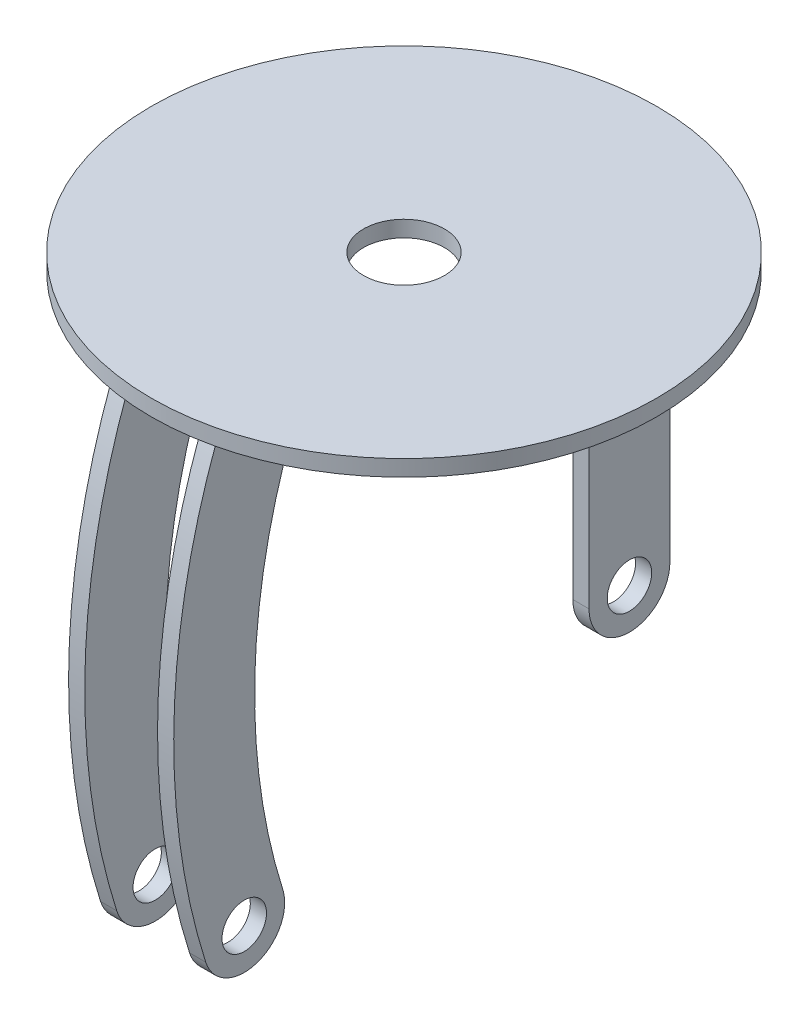
ISO-10303-21;
HEADER;
FILE_DESCRIPTION(('STEP AP214'),'2;1');
FILE_NAME('part.step','',(''),(''),'','','');
FILE_SCHEMA(('AUTOMOTIVE_DESIGN { 1 0 10303 214 1 1 1 1 }'));
ENDSEC;
DATA;
#1=APPLICATION_CONTEXT('core data for automotive mechanical design processes');
#2=APPLICATION_PROTOCOL_DEFINITION('international standard','automotive_design',2000,#1);
#3=PRODUCT_CONTEXT('',#1,'mechanical');
#4=PRODUCT('Part','Part','',(#3));
#5=PRODUCT_RELATED_PRODUCT_CATEGORY('part','',(#4));
#6=PRODUCT_DEFINITION_FORMATION('','',#4);
#7=PRODUCT_DEFINITION_CONTEXT('part definition',#1,'design');
#8=PRODUCT_DEFINITION('design','',#6,#7);
#9=PRODUCT_DEFINITION_SHAPE('','',#8);
#10=(LENGTH_UNIT() NAMED_UNIT(*) SI_UNIT(.MILLI.,.METRE.));
#11=(NAMED_UNIT(*) PLANE_ANGLE_UNIT() SI_UNIT($,.RADIAN.));
#12=(NAMED_UNIT(*) SI_UNIT($,.STERADIAN.) SOLID_ANGLE_UNIT());
#13=UNCERTAINTY_MEASURE_WITH_UNIT(LENGTH_MEASURE(1.E-05),#10,'distance_accuracy_value','');
#14=(GEOMETRIC_REPRESENTATION_CONTEXT(3) GLOBAL_UNCERTAINTY_ASSIGNED_CONTEXT((#13)) GLOBAL_UNIT_ASSIGNED_CONTEXT((#10,
#11,#12)) REPRESENTATION_CONTEXT('',''));
#15=CARTESIAN_POINT('',(0.,0.,0.));
#16=DIRECTION('',(0.,0.,1.));
#17=DIRECTION('',(1.,0.,0.));
#18=AXIS2_PLACEMENT_3D('',#15,#16,#17);
#19=CARTESIAN_POINT('',(111.5,-103.,20.));
#20=DIRECTION('',(-1.,0.,0.));
#21=DIRECTION('',(0.,0.,1.));
#22=AXIS2_PLACEMENT_3D('',#19,#20,#21);
#23=PLANE('',#22);
#24=CARTESIAN_POINT('',(111.5,-83.,0.));
#25=DIRECTION('',(1.,0.,0.));
#26=DIRECTION('',(0.,0.,-1.));
#27=AXIS2_PLACEMENT_3D('',#24,#25,#26);
#28=CIRCLE('',#27,11.);
#29=CARTESIAN_POINT('',(111.5,-83.,-11.));
#30=VERTEX_POINT('',#29);
#31=EDGE_CURVE('E245',#30,#30,#28,.T.);
#32=ORIENTED_EDGE('',*,*,#31,.F.);
#33=EDGE_LOOP('',(#32));
#34=FACE_BOUND('',#33,.T.);
#35=DIRECTION('',(0.,1.,0.));
#36=VECTOR('',#35,1.);
#37=CARTESIAN_POINT('',(111.5,-103.,20.));
#38=LINE('',#37,#36);
#39=CARTESIAN_POINT('',(111.5,-83.,20.));
#40=VERTEX_POINT('',#39);
#41=CARTESIAN_POINT('',(111.5,-4.,20.));
#42=VERTEX_POINT('',#41);
#43=EDGE_CURVE('E299',#40,#42,#38,.T.);
#44=ORIENTED_EDGE('',*,*,#43,.F.);
#45=CARTESIAN_POINT('',(111.5,-83.,0.));
#46=DIRECTION('',(1.,0.,0.));
#47=DIRECTION('',(0.,0.,-1.));
#48=AXIS2_PLACEMENT_3D('',#45,#46,#47);
#49=CIRCLE('',#48,20.);
#50=CARTESIAN_POINT('',(111.5,-83.,-20.));
#51=VERTEX_POINT('',#50);
#52=EDGE_CURVE('E239',#40,#51,#49,.T.);
#53=ORIENTED_EDGE('',*,*,#52,.T.);
#54=DIRECTION('',(0.,1.,0.));
#55=VECTOR('',#54,1.);
#56=CARTESIAN_POINT('',(111.5,-103.,-20.));
#57=LINE('',#56,#55);
#58=CARTESIAN_POINT('',(111.5,-4.,-20.));
#59=VERTEX_POINT('',#58);
#60=EDGE_CURVE('E293',#51,#59,#57,.T.);
#61=ORIENTED_EDGE('',*,*,#60,.T.);
#62=DIRECTION('',(0.,0.,1.));
#63=VECTOR('',#62,1.);
#64=CARTESIAN_POINT('',(111.5,-4.,20.));
#65=LINE('',#64,#63);
#66=EDGE_CURVE('E281',#59,#42,#65,.T.);
#67=ORIENTED_EDGE('',*,*,#66,.T.);
#68=EDGE_LOOP('',(#44,#53,#61,#67));
#69=FACE_BOUND('',#68,.T.);
#70=ADVANCED_FACE('F62',(#34,#69),#23,.F.);
#71=CARTESIAN_POINT('',(103.5,-103.,20.));
#72=DIRECTION('',(1.,0.,0.));
#73=DIRECTION('',(0.,0.,-1.));
#74=AXIS2_PLACEMENT_3D('',#71,#72,#73);
#75=PLANE('',#74);
#76=CARTESIAN_POINT('',(103.5,-83.,0.));
#77=DIRECTION('',(1.,0.,0.));
#78=DIRECTION('',(0.,0.,-1.));
#79=AXIS2_PLACEMENT_3D('',#76,#77,#78);
#80=CIRCLE('',#79,11.);
#81=CARTESIAN_POINT('',(103.5,-83.,-11.));
#82=VERTEX_POINT('',#81);
#83=EDGE_CURVE('E258',#82,#82,#80,.T.);
#84=ORIENTED_EDGE('',*,*,#83,.T.);
#85=EDGE_LOOP('',(#84));
#86=FACE_BOUND('',#85,.T.);
#87=CARTESIAN_POINT('',(103.5,-83.,0.));
#88=DIRECTION('',(1.,0.,0.));
#89=DIRECTION('',(0.,0.,-1.));
#90=AXIS2_PLACEMENT_3D('',#87,#88,#89);
#91=CIRCLE('',#90,20.);
#92=CARTESIAN_POINT('',(103.5,-83.,20.));
#93=VERTEX_POINT('',#92);
#94=CARTESIAN_POINT('',(103.5,-83.,-20.));
#95=VERTEX_POINT('',#94);
#96=EDGE_CURVE('E252',#93,#95,#91,.T.);
#97=ORIENTED_EDGE('',*,*,#96,.F.);
#98=DIRECTION('',(0.,1.,0.));
#99=VECTOR('',#98,1.);
#100=CARTESIAN_POINT('',(103.5,-103.,20.));
#101=LINE('',#100,#99);
#102=CARTESIAN_POINT('',(103.5,-4.,20.));
#103=VERTEX_POINT('',#102);
#104=EDGE_CURVE('E297',#93,#103,#101,.T.);
#105=ORIENTED_EDGE('',*,*,#104,.T.);
#106=DIRECTION('',(0.,0.,-1.));
#107=VECTOR('',#106,1.);
#108=CARTESIAN_POINT('',(103.5,-4.,20.));
#109=LINE('',#108,#107);
#110=CARTESIAN_POINT('',(103.5,-4.,-20.));
#111=VERTEX_POINT('',#110);
#112=EDGE_CURVE('E287',#103,#111,#109,.T.);
#113=ORIENTED_EDGE('',*,*,#112,.T.);
#114=DIRECTION('',(0.,1.,0.));
#115=VECTOR('',#114,1.);
#116=CARTESIAN_POINT('',(103.5,-103.,-20.));
#117=LINE('',#116,#115);
#118=EDGE_CURVE('E295',#95,#111,#117,.T.);
#119=ORIENTED_EDGE('',*,*,#118,.F.);
#120=EDGE_LOOP('',(#97,#105,#113,#119));
#121=FACE_BOUND('',#120,.T.);
#122=ADVANCED_FACE('F329',(#86,#121),#75,.F.);
#123=CARTESIAN_POINT('',(-103.5,-103.,20.));
#124=DIRECTION('',(-1.,0.,0.));
#125=DIRECTION('',(0.,0.,1.));
#126=AXIS2_PLACEMENT_3D('',#123,#124,#125);
#127=PLANE('',#126);
#128=CARTESIAN_POINT('',(-103.5,-83.,0.));
#129=DIRECTION('',(-1.,0.,0.));
#130=DIRECTION('',(0.,0.,1.));
#131=AXIS2_PLACEMENT_3D('',#128,#129,#130);
#132=CIRCLE('',#131,11.);
#133=CARTESIAN_POINT('',(-103.5,-83.,-11.));
#134=VERTEX_POINT('',#133);
#135=EDGE_CURVE('E255',#134,#134,#132,.T.);
#136=ORIENTED_EDGE('',*,*,#135,.T.);
#137=EDGE_LOOP('',(#136));
#138=FACE_BOUND('',#137,.T.);
#139=DIRECTION('',(0.,1.,0.));
#140=VECTOR('',#139,1.);
#141=CARTESIAN_POINT('',(-103.5,-103.,20.));
#142=LINE('',#141,#140);
#143=CARTESIAN_POINT('',(-103.5,-83.,20.));
#144=VERTEX_POINT('',#143);
#145=CARTESIAN_POINT('',(-103.5,-4.,20.));
#146=VERTEX_POINT('',#145);
#147=EDGE_CURVE('E279',#144,#146,#142,.T.);
#148=ORIENTED_EDGE('',*,*,#147,.F.);
#149=CARTESIAN_POINT('',(-103.5,-83.,0.));
#150=DIRECTION('',(-1.,0.,0.));
#151=DIRECTION('',(0.,0.,1.));
#152=AXIS2_PLACEMENT_3D('',#149,#150,#151);
#153=CIRCLE('',#152,20.);
#154=CARTESIAN_POINT('',(-103.5,-83.,-20.));
#155=VERTEX_POINT('',#154);
#156=EDGE_CURVE('E250',#155,#144,#153,.T.);
#157=ORIENTED_EDGE('',*,*,#156,.F.);
#158=DIRECTION('',(0.,1.,0.));
#159=VECTOR('',#158,1.);
#160=CARTESIAN_POINT('',(-103.5,-103.,-20.));
#161=LINE('',#160,#159);
#162=CARTESIAN_POINT('',(-103.5,-4.,-20.));
#163=VERTEX_POINT('',#162);
#164=EDGE_CURVE('E273',#155,#163,#161,.T.);
#165=ORIENTED_EDGE('',*,*,#164,.T.);
#166=DIRECTION('',(0.,0.,1.));
#167=VECTOR('',#166,1.);
#168=CARTESIAN_POINT('',(-103.5,-4.,20.));
#169=LINE('',#168,#167);
#170=EDGE_CURVE('E261',#163,#146,#169,.T.);
#171=ORIENTED_EDGE('',*,*,#170,.T.);
#172=EDGE_LOOP('',(#148,#157,#165,#171));
#173=FACE_BOUND('',#172,.T.);
#174=ADVANCED_FACE('F326',(#138,#173),#127,.F.);
#175=CARTESIAN_POINT('',(-111.5,-103.,20.));
#176=DIRECTION('',(1.,0.,0.));
#177=DIRECTION('',(0.,0.,-1.));
#178=AXIS2_PLACEMENT_3D('',#175,#176,#177);
#179=PLANE('',#178);
#180=CARTESIAN_POINT('',(-111.5,-83.,0.));
#181=DIRECTION('',(1.,0.,0.));
#182=DIRECTION('',(0.,0.,-1.));
#183=AXIS2_PLACEMENT_3D('',#180,#181,#182);
#184=CIRCLE('',#183,11.);
#185=CARTESIAN_POINT('',(-111.5,-83.,-11.));
#186=VERTEX_POINT('',#185);
#187=EDGE_CURVE('E254',#186,#186,#184,.T.);
#188=ORIENTED_EDGE('',*,*,#187,.T.);
#189=EDGE_LOOP('',(#188));
#190=FACE_BOUND('',#189,.T.);
#191=CARTESIAN_POINT('',(-111.5,-83.,0.));
#192=DIRECTION('',(1.,0.,0.));
#193=DIRECTION('',(0.,0.,-1.));
#194=AXIS2_PLACEMENT_3D('',#191,#192,#193);
#195=CIRCLE('',#194,20.);
#196=CARTESIAN_POINT('',(-111.5,-83.,20.));
#197=VERTEX_POINT('',#196);
#198=CARTESIAN_POINT('',(-111.5,-83.,-20.));
#199=VERTEX_POINT('',#198);
#200=EDGE_CURVE('E248',#197,#199,#195,.T.);
#201=ORIENTED_EDGE('',*,*,#200,.F.);
#202=DIRECTION('',(0.,1.,0.));
#203=VECTOR('',#202,1.);
#204=CARTESIAN_POINT('',(-111.5,-103.,20.));
#205=LINE('',#204,#203);
#206=CARTESIAN_POINT('',(-111.5,-4.,20.));
#207=VERTEX_POINT('',#206);
#208=EDGE_CURVE('E277',#197,#207,#205,.T.);
#209=ORIENTED_EDGE('',*,*,#208,.T.);
#210=DIRECTION('',(0.,0.,-1.));
#211=VECTOR('',#210,1.);
#212=CARTESIAN_POINT('',(-111.5,-4.,20.));
#213=LINE('',#212,#211);
#214=CARTESIAN_POINT('',(-111.5,-4.,-20.));
#215=VERTEX_POINT('',#214);
#216=EDGE_CURVE('E267',#207,#215,#213,.T.);
#217=ORIENTED_EDGE('',*,*,#216,.T.);
#218=DIRECTION('',(0.,1.,0.));
#219=VECTOR('',#218,1.);
#220=CARTESIAN_POINT('',(-111.5,-103.,-20.));
#221=LINE('',#220,#219);
#222=EDGE_CURVE('E275',#199,#215,#221,.T.);
#223=ORIENTED_EDGE('',*,*,#222,.F.);
#224=EDGE_LOOP('',(#201,#209,#217,#223));
#225=FACE_BOUND('',#224,.T.);
#226=ADVANCED_FACE('F314',(#190,#225),#179,.F.);
#227=CARTESIAN_POINT('',(103.5,-103.,-20.));
#228=DIRECTION('',(0.,0.,1.));
#229=DIRECTION('',(1.,0.,0.));
#230=AXIS2_PLACEMENT_3D('',#227,#228,#229);
#231=PLANE('',#230);
#232=DIRECTION('',(1.,0.,0.));
#233=VECTOR('',#232,1.);
#234=CARTESIAN_POINT('',(-125.,-83.,-20.));
#235=LINE('',#234,#233);
#236=EDGE_CURVE('E242',#95,#51,#235,.T.);
#237=ORIENTED_EDGE('',*,*,#236,.F.);
#238=ORIENTED_EDGE('',*,*,#118,.T.);
#239=DIRECTION('',(1.,0.,0.));
#240=VECTOR('',#239,1.);
#241=CARTESIAN_POINT('',(103.5,-4.,-20.));
#242=LINE('',#241,#240);
#243=EDGE_CURVE('E290',#111,#59,#242,.T.);
#244=ORIENTED_EDGE('',*,*,#243,.T.);
#245=ORIENTED_EDGE('',*,*,#60,.F.);
#246=EDGE_LOOP('',(#237,#238,#244,#245));
#247=FACE_BOUND('',#246,.T.);
#248=ADVANCED_FACE('F350',(#247),#231,.F.);
#249=CARTESIAN_POINT('',(-111.5,-103.,-20.));
#250=DIRECTION('',(0.,0.,1.));
#251=DIRECTION('',(1.,0.,0.));
#252=AXIS2_PLACEMENT_3D('',#249,#250,#251);
#253=PLANE('',#252);
#254=EDGE_CURVE('E244',#199,#155,#235,.T.);
#255=ORIENTED_EDGE('',*,*,#254,.F.);
#256=ORIENTED_EDGE('',*,*,#222,.T.);
#257=DIRECTION('',(1.,0.,0.));
#258=VECTOR('',#257,1.);
#259=CARTESIAN_POINT('',(-111.5,-4.,-20.));
#260=LINE('',#259,#258);
#261=EDGE_CURVE('E270',#215,#163,#260,.T.);
#262=ORIENTED_EDGE('',*,*,#261,.T.);
#263=ORIENTED_EDGE('',*,*,#164,.F.);
#264=EDGE_LOOP('',(#255,#256,#262,#263));
#265=FACE_BOUND('',#264,.T.);
#266=ADVANCED_FACE('F348',(#265),#253,.F.);
#267=CARTESIAN_POINT('',(0.,-4.,0.));
#268=DIRECTION('',(0.,1.,0.));
#269=DIRECTION('',(0.,0.,1.));
#270=AXIS2_PLACEMENT_3D('',#267,#268,#269);
#271=PLANE('',#270);
#272=DIRECTION('',(-1.,0.,0.));
#273=VECTOR('',#272,1.);
#274=CARTESIAN_POINT('',(-18.,-4.00000000000003,118.540084835947));
#275=LINE('',#274,#273);
#276=CARTESIAN_POINT('',(-18.,-4.,118.540084835947));
#277=VERTEX_POINT('',#276);
#278=CARTESIAN_POINT('',(-26.,-4.,118.540084835947));
#279=VERTEX_POINT('',#278);
#280=EDGE_CURVE('E77',#277,#279,#275,.T.);
#281=ORIENTED_EDGE('',*,*,#280,.F.);
#282=DIRECTION('',(0.,0.,-1.));
#283=VECTOR('',#282,1.);
#284=CARTESIAN_POINT('',(-18.,-4.00000000000001,0.));
#285=LINE('',#284,#283);
#286=CARTESIAN_POINT('',(-18.,-4.,75.4599151640533));
#287=VERTEX_POINT('',#286);
#288=EDGE_CURVE('E82',#277,#287,#285,.T.);
#289=ORIENTED_EDGE('',*,*,#288,.T.);
#290=DIRECTION('',(-1.,0.,0.));
#291=VECTOR('',#290,1.);
#292=CARTESIAN_POINT('',(-18.,-4.00000000000002,75.4599151640533));
#293=LINE('',#292,#291);
#294=CARTESIAN_POINT('',(-26.,-4.00000000000002,75.4599151640533));
#295=VERTEX_POINT('',#294);
#296=EDGE_CURVE('E200',#287,#295,#293,.T.);
#297=ORIENTED_EDGE('',*,*,#296,.T.);
#298=DIRECTION('',(0.,0.,-1.));
#299=VECTOR('',#298,1.);
#300=CARTESIAN_POINT('',(-26.,-4.00000000000001,0.));
#301=LINE('',#300,#299);
#302=EDGE_CURVE('E692',#279,#295,#301,.T.);
#303=ORIENTED_EDGE('',*,*,#302,.F.);
#304=EDGE_LOOP('',(#281,#289,#297,#303));
#305=FACE_BOUND('',#304,.T.);
#306=DIRECTION('',(-1.,0.,0.));
#307=VECTOR('',#306,1.);
#308=CARTESIAN_POINT('',(26.,-4.00000000000003,118.540084835947));
#309=LINE('',#308,#307);
#310=CARTESIAN_POINT('',(26.,-4.,118.540084835947));
#311=VERTEX_POINT('',#310);
#312=CARTESIAN_POINT('',(18.,-4.,118.540084835947));
#313=VERTEX_POINT('',#312);
#314=EDGE_CURVE('E229',#311,#313,#309,.T.);
#315=ORIENTED_EDGE('',*,*,#314,.F.);
#316=DIRECTION('',(0.,0.,-1.));
#317=VECTOR('',#316,1.);
#318=CARTESIAN_POINT('',(26.,-4.00000000000001,0.));
#319=LINE('',#318,#317);
#320=CARTESIAN_POINT('',(26.,-4.,75.4599151640533));
#321=VERTEX_POINT('',#320);
#322=EDGE_CURVE('E210',#311,#321,#319,.T.);
#323=ORIENTED_EDGE('',*,*,#322,.T.);
#324=DIRECTION('',(-1.,0.,0.));
#325=VECTOR('',#324,1.);
#326=CARTESIAN_POINT('',(26.,-4.00000000000002,75.4599151640533));
#327=LINE('',#326,#325);
#328=CARTESIAN_POINT('',(18.,-4.00000000000002,75.4599151640533));
#329=VERTEX_POINT('',#328);
#330=EDGE_CURVE('E232',#321,#329,#327,.T.);
#331=ORIENTED_EDGE('',*,*,#330,.T.);
#332=DIRECTION('',(0.,0.,-1.));
#333=VECTOR('',#332,1.);
#334=CARTESIAN_POINT('',(18.,-4.00000000000001,0.));
#335=LINE('',#334,#333);
#336=EDGE_CURVE('E220',#313,#329,#335,.T.);
#337=ORIENTED_EDGE('',*,*,#336,.F.);
#338=EDGE_LOOP('',(#315,#323,#331,#337));
#339=FACE_BOUND('',#338,.T.);
#340=ORIENTED_EDGE('',*,*,#66,.F.);
#341=ORIENTED_EDGE('',*,*,#243,.F.);
#342=ORIENTED_EDGE('',*,*,#112,.F.);
#343=DIRECTION('',(-1.,0.,0.));
#344=VECTOR('',#343,1.);
#345=CARTESIAN_POINT('',(103.5,-4.,20.));
#346=LINE('',#345,#344);
#347=EDGE_CURVE('E284',#42,#103,#346,.T.);
#348=ORIENTED_EDGE('',*,*,#347,.F.);
#349=EDGE_LOOP('',(#340,#341,#342,#348));
#350=FACE_BOUND('',#349,.T.);
#351=CARTESIAN_POINT('',(0.,-4.,0.));
#352=DIRECTION('',(0.,1.,0.));
#353=DIRECTION('',(0.,0.,1.));
#354=AXIS2_PLACEMENT_3D('',#351,#352,#353);
#355=CIRCLE('',#354,125.);
#356=CARTESIAN_POINT('',(0.,-4.,125.));
#357=VERTEX_POINT('',#356);
#358=EDGE_CURVE('E305',#357,#357,#355,.T.);
#359=ORIENTED_EDGE('',*,*,#358,.F.);
#360=EDGE_LOOP('',(#359));
#361=FACE_BOUND('',#360,.T.);
#362=CARTESIAN_POINT('',(0.,-4.,0.));
#363=DIRECTION('',(0.,1.,0.));
#364=DIRECTION('',(0.,0.,1.));
#365=AXIS2_PLACEMENT_3D('',#362,#363,#364);
#366=CIRCLE('',#365,20.);
#367=CARTESIAN_POINT('',(0.,-4.,20.));
#368=VERTEX_POINT('',#367);
#369=EDGE_CURVE('E301',#368,#368,#366,.T.);
#370=ORIENTED_EDGE('',*,*,#369,.T.);
#371=EDGE_LOOP('',(#370));
#372=FACE_BOUND('',#371,.T.);
#373=ORIENTED_EDGE('',*,*,#170,.F.);
#374=ORIENTED_EDGE('',*,*,#261,.F.);
#375=ORIENTED_EDGE('',*,*,#216,.F.);
#376=DIRECTION('',(-1.,0.,0.));
#377=VECTOR('',#376,1.);
#378=CARTESIAN_POINT('',(-111.5,-4.,20.));
#379=LINE('',#378,#377);
#380=EDGE_CURVE('E264',#146,#207,#379,.T.);
#381=ORIENTED_EDGE('',*,*,#380,.F.);
#382=EDGE_LOOP('',(#373,#374,#375,#381));
#383=FACE_BOUND('',#382,.T.);
#384=ADVANCED_FACE('F342',(#305,#339,#350,#361,#372,#383),#271,.F.);
#385=CARTESIAN_POINT('',(0.,4.,0.));
#386=DIRECTION('',(0.,1.,0.));
#387=DIRECTION('',(0.,0.,1.));
#388=AXIS2_PLACEMENT_3D('',#385,#386,#387);
#389=PLANE('',#388);
#390=CARTESIAN_POINT('',(0.,4.,0.));
#391=DIRECTION('',(0.,1.,0.));
#392=DIRECTION('',(0.,0.,1.));
#393=AXIS2_PLACEMENT_3D('',#390,#391,#392);
#394=CIRCLE('',#393,125.);
#395=CARTESIAN_POINT('',(0.,4.,125.));
#396=VERTEX_POINT('',#395);
#397=EDGE_CURVE('E70',#396,#396,#394,.T.);
#398=ORIENTED_EDGE('',*,*,#397,.T.);
#399=EDGE_LOOP('',(#398));
#400=FACE_BOUND('',#399,.T.);
#401=CARTESIAN_POINT('',(0.,4.,0.));
#402=DIRECTION('',(0.,1.,0.));
#403=DIRECTION('',(0.,0.,1.));
#404=AXIS2_PLACEMENT_3D('',#401,#402,#403);
#405=CIRCLE('',#404,20.);
#406=CARTESIAN_POINT('',(0.,4.,20.));
#407=VERTEX_POINT('',#406);
#408=EDGE_CURVE('E302',#407,#407,#405,.T.);
#409=ORIENTED_EDGE('',*,*,#408,.F.);
#410=EDGE_LOOP('',(#409));
#411=FACE_BOUND('',#410,.T.);
#412=ADVANCED_FACE('F356',(#400,#411),#389,.T.);
#413=CARTESIAN_POINT('',(0.,4.,0.));
#414=DIRECTION('',(0.,-1.,0.));
#415=DIRECTION('',(0.,0.,-1.));
#416=AXIS2_PLACEMENT_3D('',#413,#414,#415);
#417=CYLINDRICAL_SURFACE('',#416,125.);
#418=ORIENTED_EDGE('',*,*,#397,.F.);
#419=EDGE_LOOP('',(#418));
#420=FACE_BOUND('',#419,.T.);
#421=ORIENTED_EDGE('',*,*,#358,.T.);
#422=EDGE_LOOP('',(#421));
#423=FACE_BOUND('',#422,.T.);
#424=ADVANCED_FACE('F64',(#420,#423),#417,.T.);
#425=CARTESIAN_POINT('',(0.,4.,0.));
#426=DIRECTION('',(0.,-1.,0.));
#427=DIRECTION('',(0.,0.,-1.));
#428=AXIS2_PLACEMENT_3D('',#425,#426,#427);
#429=CYLINDRICAL_SURFACE('',#428,20.);
#430=ORIENTED_EDGE('',*,*,#408,.T.);
#431=EDGE_LOOP('',(#430));
#432=FACE_BOUND('',#431,.T.);
#433=ORIENTED_EDGE('',*,*,#369,.F.);
#434=EDGE_LOOP('',(#433));
#435=FACE_BOUND('',#434,.T.);
#436=ADVANCED_FACE('F373',(#432,#435),#429,.F.);
#437=CARTESIAN_POINT('',(103.5,-103.,20.));
#438=DIRECTION('',(0.,0.,-1.));
#439=DIRECTION('',(-1.,0.,0.));
#440=AXIS2_PLACEMENT_3D('',#437,#438,#439);
#441=PLANE('',#440);
#442=ORIENTED_EDGE('',*,*,#104,.F.);
#443=DIRECTION('',(1.,0.,0.));
#444=VECTOR('',#443,1.);
#445=CARTESIAN_POINT('',(-125.,-83.,20.));
#446=LINE('',#445,#444);
#447=EDGE_CURVE('E236',#93,#40,#446,.T.);
#448=ORIENTED_EDGE('',*,*,#447,.T.);
#449=ORIENTED_EDGE('',*,*,#43,.T.);
#450=ORIENTED_EDGE('',*,*,#347,.T.);
#451=EDGE_LOOP('',(#442,#448,#449,#450));
#452=FACE_BOUND('',#451,.T.);
#453=ADVANCED_FACE('F372',(#452),#441,.F.);
#454=CARTESIAN_POINT('',(-111.5,-103.,20.));
#455=DIRECTION('',(0.,0.,-1.));
#456=DIRECTION('',(-1.,0.,0.));
#457=AXIS2_PLACEMENT_3D('',#454,#455,#456);
#458=PLANE('',#457);
#459=ORIENTED_EDGE('',*,*,#208,.F.);
#460=DIRECTION('',(1.,0.,0.));
#461=VECTOR('',#460,1.);
#462=CARTESIAN_POINT('',(-125.,-83.,20.));
#463=LINE('',#462,#461);
#464=EDGE_CURVE('E12',#197,#144,#463,.T.);
#465=ORIENTED_EDGE('',*,*,#464,.T.);
#466=ORIENTED_EDGE('',*,*,#147,.T.);
#467=ORIENTED_EDGE('',*,*,#380,.T.);
#468=EDGE_LOOP('',(#459,#465,#466,#467));
#469=FACE_BOUND('',#468,.T.);
#470=ADVANCED_FACE('F338',(#469),#458,.F.);
#471=CARTESIAN_POINT('',(-125.,-83.,0.));
#472=DIRECTION('',(1.,0.,0.));
#473=DIRECTION('',(0.,0.,-1.));
#474=AXIS2_PLACEMENT_3D('',#471,#472,#473);
#475=CYLINDRICAL_SURFACE('',#474,20.);
#476=ORIENTED_EDGE('',*,*,#156,.T.);
#477=ORIENTED_EDGE('',*,*,#464,.F.);
#478=ORIENTED_EDGE('',*,*,#200,.T.);
#479=ORIENTED_EDGE('',*,*,#254,.T.);
#480=EDGE_LOOP('',(#476,#477,#478,#479));
#481=FACE_BOUND('',#480,.T.);
#482=ADVANCED_FACE('F321',(#481),#475,.T.);
#483=CARTESIAN_POINT('',(-125.,-83.,0.));
#484=DIRECTION('',(1.,0.,0.));
#485=DIRECTION('',(0.,0.,-1.));
#486=AXIS2_PLACEMENT_3D('',#483,#484,#485);
#487=CYLINDRICAL_SURFACE('',#486,11.);
#488=CARTESIAN_POINT('',(-111.5,-83.,-11.));
#489=CARTESIAN_POINT('',(-111.416666666667,-83.,-11.));
#490=CARTESIAN_POINT('',(-111.333333333333,-83.,-11.));
#491=CARTESIAN_POINT('',(-111.166666666667,-83.,-11.));
#492=CARTESIAN_POINT('',(-111.083333333333,-83.,-11.));
#493=CARTESIAN_POINT('',(-110.916666666667,-83.,-11.));
#494=CARTESIAN_POINT('',(-110.833333333333,-83.,-11.));
#495=CARTESIAN_POINT('',(-110.666666666667,-83.,-11.));
#496=CARTESIAN_POINT('',(-110.583333333333,-83.,-11.));
#497=CARTESIAN_POINT('',(-110.416666666667,-83.,-11.));
#498=CARTESIAN_POINT('',(-110.333333333333,-83.,-11.));
#499=CARTESIAN_POINT('',(-110.166666666667,-83.,-11.));
#500=CARTESIAN_POINT('',(-110.083333333333,-83.,-11.));
#501=CARTESIAN_POINT('',(-109.916666666667,-83.,-11.));
#502=CARTESIAN_POINT('',(-109.833333333333,-83.,-11.));
#503=CARTESIAN_POINT('',(-109.666666666667,-83.,-11.));
#504=CARTESIAN_POINT('',(-109.583333333333,-83.,-11.));
#505=CARTESIAN_POINT('',(-109.416666666667,-83.,-11.));
#506=CARTESIAN_POINT('',(-109.333333333333,-83.,-11.));
#507=CARTESIAN_POINT('',(-109.166666666667,-83.,-11.));
#508=CARTESIAN_POINT('',(-109.083333333333,-83.,-11.));
#509=CARTESIAN_POINT('',(-108.916666666667,-83.,-11.));
#510=CARTESIAN_POINT('',(-108.833333333333,-83.,-11.));
#511=CARTESIAN_POINT('',(-108.666666666667,-83.,-11.));
#512=CARTESIAN_POINT('',(-108.583333333333,-83.,-11.));
#513=CARTESIAN_POINT('',(-108.416666666667,-83.,-11.));
#514=CARTESIAN_POINT('',(-108.333333333333,-83.,-11.));
#515=CARTESIAN_POINT('',(-108.166666666667,-83.,-11.));
#516=CARTESIAN_POINT('',(-108.083333333333,-83.,-11.));
#517=CARTESIAN_POINT('',(-107.916666666667,-83.,-11.));
#518=CARTESIAN_POINT('',(-107.833333333333,-83.,-11.));
#519=CARTESIAN_POINT('',(-107.666666666667,-83.,-11.));
#520=CARTESIAN_POINT('',(-107.583333333333,-83.,-11.));
#521=CARTESIAN_POINT('',(-107.416666666667,-83.,-11.));
#522=CARTESIAN_POINT('',(-107.333333333333,-83.,-11.));
#523=CARTESIAN_POINT('',(-107.166666666667,-83.,-11.));
#524=CARTESIAN_POINT('',(-107.083333333333,-83.,-11.));
#525=CARTESIAN_POINT('',(-106.916666666667,-83.,-11.));
#526=CARTESIAN_POINT('',(-106.833333333333,-83.,-11.));
#527=CARTESIAN_POINT('',(-106.666666666667,-83.,-11.));
#528=CARTESIAN_POINT('',(-106.583333333333,-83.,-11.));
#529=CARTESIAN_POINT('',(-106.416666666667,-83.,-11.));
#530=CARTESIAN_POINT('',(-106.333333333333,-83.,-11.));
#531=CARTESIAN_POINT('',(-106.166666666667,-83.,-11.));
#532=CARTESIAN_POINT('',(-106.083333333333,-83.,-11.));
#533=CARTESIAN_POINT('',(-105.916666666667,-83.,-11.));
#534=CARTESIAN_POINT('',(-105.833333333333,-83.,-11.));
#535=CARTESIAN_POINT('',(-105.666666666667,-83.,-11.));
#536=CARTESIAN_POINT('',(-105.583333333333,-83.,-11.));
#537=CARTESIAN_POINT('',(-105.416666666667,-83.,-11.));
#538=CARTESIAN_POINT('',(-105.333333333333,-83.,-11.));
#539=CARTESIAN_POINT('',(-105.166666666667,-83.,-11.));
#540=CARTESIAN_POINT('',(-105.083333333333,-83.,-11.));
#541=CARTESIAN_POINT('',(-104.916666666667,-83.,-11.));
#542=CARTESIAN_POINT('',(-104.833333333333,-83.,-11.));
#543=CARTESIAN_POINT('',(-104.666666666667,-83.,-11.));
#544=CARTESIAN_POINT('',(-104.583333333333,-83.,-11.));
#545=CARTESIAN_POINT('',(-104.416666666667,-83.,-11.));
#546=CARTESIAN_POINT('',(-104.333333333333,-83.,-11.));
#547=CARTESIAN_POINT('',(-104.166666666667,-83.,-11.));
#548=CARTESIAN_POINT('',(-104.083333333333,-83.,-11.));
#549=CARTESIAN_POINT('',(-103.916666666667,-83.,-11.));
#550=CARTESIAN_POINT('',(-103.833333333333,-83.,-11.));
#551=CARTESIAN_POINT('',(-103.666666666667,-83.,-11.));
#552=CARTESIAN_POINT('',(-103.583333333333,-83.,-11.));
#553=CARTESIAN_POINT('',(-103.5,-83.,-11.));
#554=B_SPLINE_CURVE_WITH_KNOTS('',3,(#488,#489,#490,#491,#492,#493,#494,#495,#496,#497,#498,
#499,#500,#501,#502,#503,#504,#505,#506,#507,#508,#509,#510,#511,#512,#513,#514,#515,#516,#517,
#518,#519,#520,#521,#522,#523,#524,#525,#526,#527,#528,#529,#530,#531,#532,#533,#534,#535,#536,
#537,#538,#539,#540,#541,#542,#543,#544,#545,#546,#547,#548,#549,#550,#551,#552,#553),
.UNSPECIFIED.,.F.,.F.,(4,2,2,2,2,2,2,2,2,2,2,2,2,2,2,2,2,2,2,2,2,2,2,2,2,2,2,2,2,2,2,2,4),(0.,
0.25,0.5,0.750000000000001,1.,1.25,1.5,1.75,2.,2.25,2.5,2.75,3.,3.25,3.5,3.75,4.,4.25,4.5,4.75,
5.,5.25,5.50000000000001,5.75000000000001,6.00000000000001,6.25000000000001,6.50000000000001,
6.75000000000001,7.00000000000001,7.25000000000001,7.50000000000001,7.75000000000001,
8.00000000000001),.UNSPECIFIED.);
#555=EDGE_CURVE('BSEAM317',#186,#134,#554,.T.);
#556=ORIENTED_EDGE('',*,*,#187,.F.);
#557=ORIENTED_EDGE('',*,*,#135,.F.);
#558=ORIENTED_EDGE('',*,*,#555,.T.);
#559=ORIENTED_EDGE('',*,*,#555,.F.);
#560=EDGE_LOOP('',(#556,#558,#557,#559));
#561=FACE_BOUND('',#560,.T.);
#562=ADVANCED_FACE('F317',(#561),#487,.F.);
#563=ORIENTED_EDGE('',*,*,#96,.T.);
#564=ORIENTED_EDGE('',*,*,#236,.T.);
#565=ORIENTED_EDGE('',*,*,#52,.F.);
#566=ORIENTED_EDGE('',*,*,#447,.F.);
#567=EDGE_LOOP('',(#563,#564,#565,#566));
#568=FACE_BOUND('',#567,.T.);
#569=ADVANCED_FACE('F320',(#568),#475,.T.);
#570=CARTESIAN_POINT('',(111.5,-83.,-11.));
#571=CARTESIAN_POINT('',(111.416666666667,-83.,-11.));
#572=CARTESIAN_POINT('',(111.333333333333,-83.,-11.));
#573=CARTESIAN_POINT('',(111.166666666667,-83.,-11.));
#574=CARTESIAN_POINT('',(111.083333333333,-83.,-11.));
#575=CARTESIAN_POINT('',(110.916666666667,-83.,-11.));
#576=CARTESIAN_POINT('',(110.833333333333,-83.,-11.));
#577=CARTESIAN_POINT('',(110.666666666667,-83.,-11.));
#578=CARTESIAN_POINT('',(110.583333333333,-83.,-11.));
#579=CARTESIAN_POINT('',(110.416666666667,-83.,-11.));
#580=CARTESIAN_POINT('',(110.333333333333,-83.,-11.));
#581=CARTESIAN_POINT('',(110.166666666667,-83.,-11.));
#582=CARTESIAN_POINT('',(110.083333333333,-83.,-11.));
#583=CARTESIAN_POINT('',(109.916666666667,-83.,-11.));
#584=CARTESIAN_POINT('',(109.833333333333,-83.,-11.));
#585=CARTESIAN_POINT('',(109.666666666667,-83.,-11.));
#586=CARTESIAN_POINT('',(109.583333333333,-83.,-11.));
#587=CARTESIAN_POINT('',(109.416666666667,-83.,-11.));
#588=CARTESIAN_POINT('',(109.333333333333,-83.,-11.));
#589=CARTESIAN_POINT('',(109.166666666667,-83.,-11.));
#590=CARTESIAN_POINT('',(109.083333333333,-83.,-11.));
#591=CARTESIAN_POINT('',(108.916666666667,-83.,-11.));
#592=CARTESIAN_POINT('',(108.833333333333,-83.,-11.));
#593=CARTESIAN_POINT('',(108.666666666667,-83.,-11.));
#594=CARTESIAN_POINT('',(108.583333333333,-83.,-11.));
#595=CARTESIAN_POINT('',(108.416666666667,-83.,-11.));
#596=CARTESIAN_POINT('',(108.333333333333,-83.,-11.));
#597=CARTESIAN_POINT('',(108.166666666667,-83.,-11.));
#598=CARTESIAN_POINT('',(108.083333333333,-83.,-11.));
#599=CARTESIAN_POINT('',(107.916666666667,-83.,-11.));
#600=CARTESIAN_POINT('',(107.833333333333,-83.,-11.));
#601=CARTESIAN_POINT('',(107.666666666667,-83.,-11.));
#602=CARTESIAN_POINT('',(107.583333333333,-83.,-11.));
#603=CARTESIAN_POINT('',(107.416666666667,-83.,-11.));
#604=CARTESIAN_POINT('',(107.333333333333,-83.,-11.));
#605=CARTESIAN_POINT('',(107.166666666667,-83.,-11.));
#606=CARTESIAN_POINT('',(107.083333333333,-83.,-11.));
#607=CARTESIAN_POINT('',(106.916666666667,-83.,-11.));
#608=CARTESIAN_POINT('',(106.833333333333,-83.,-11.));
#609=CARTESIAN_POINT('',(106.666666666667,-83.,-11.));
#610=CARTESIAN_POINT('',(106.583333333333,-83.,-11.));
#611=CARTESIAN_POINT('',(106.416666666667,-83.,-11.));
#612=CARTESIAN_POINT('',(106.333333333333,-83.,-11.));
#613=CARTESIAN_POINT('',(106.166666666667,-83.,-11.));
#614=CARTESIAN_POINT('',(106.083333333333,-83.,-11.));
#615=CARTESIAN_POINT('',(105.916666666667,-83.,-11.));
#616=CARTESIAN_POINT('',(105.833333333333,-83.,-11.));
#617=CARTESIAN_POINT('',(105.666666666667,-83.,-11.));
#618=CARTESIAN_POINT('',(105.583333333333,-83.,-11.));
#619=CARTESIAN_POINT('',(105.416666666667,-83.,-11.));
#620=CARTESIAN_POINT('',(105.333333333333,-83.,-11.));
#621=CARTESIAN_POINT('',(105.166666666667,-83.,-11.));
#622=CARTESIAN_POINT('',(105.083333333333,-83.,-11.));
#623=CARTESIAN_POINT('',(104.916666666667,-83.,-11.));
#624=CARTESIAN_POINT('',(104.833333333333,-83.,-11.));
#625=CARTESIAN_POINT('',(104.666666666667,-83.,-11.));
#626=CARTESIAN_POINT('',(104.583333333333,-83.,-11.));
#627=CARTESIAN_POINT('',(104.416666666667,-83.,-11.));
#628=CARTESIAN_POINT('',(104.333333333333,-83.,-11.));
#629=CARTESIAN_POINT('',(104.166666666667,-83.,-11.));
#630=CARTESIAN_POINT('',(104.083333333333,-83.,-11.));
#631=CARTESIAN_POINT('',(103.916666666667,-83.,-11.));
#632=CARTESIAN_POINT('',(103.833333333333,-83.,-11.));
#633=CARTESIAN_POINT('',(103.666666666667,-83.,-11.));
#634=CARTESIAN_POINT('',(103.583333333333,-83.,-11.));
#635=CARTESIAN_POINT('',(103.5,-83.,-11.));
#636=B_SPLINE_CURVE_WITH_KNOTS('',3,(#570,#571,#572,#573,#574,#575,#576,#577,#578,#579,#580,
#581,#582,#583,#584,#585,#586,#587,#588,#589,#590,#591,#592,#593,#594,#595,#596,#597,#598,#599,
#600,#601,#602,#603,#604,#605,#606,#607,#608,#609,#610,#611,#612,#613,#614,#615,#616,#617,#618,
#619,#620,#621,#622,#623,#624,#625,#626,#627,#628,#629,#630,#631,#632,#633,#634,#635),
.UNSPECIFIED.,.F.,.F.,(4,2,2,2,2,2,2,2,2,2,2,2,2,2,2,2,2,2,2,2,2,2,2,2,2,2,2,2,2,2,2,2,4),(0.,
0.25,0.5,0.750000000000001,1.,1.25,1.5,1.75,2.,2.25,2.5,2.75,3.,3.25,3.5,3.75,4.,4.25,4.5,4.75,
5.,5.25,5.50000000000001,5.75000000000001,6.00000000000001,6.25000000000001,6.50000000000001,
6.75000000000001,7.00000000000001,7.25000000000001,7.50000000000001,7.75000000000001,
8.00000000000001),.UNSPECIFIED.);
#637=EDGE_CURVE('BSEAM323',#30,#82,#636,.T.);
#638=ORIENTED_EDGE('',*,*,#31,.T.);
#639=ORIENTED_EDGE('',*,*,#83,.F.);
#640=ORIENTED_EDGE('',*,*,#637,.T.);
#641=ORIENTED_EDGE('',*,*,#637,.F.);
#642=EDGE_LOOP('',(#638,#640,#639,#641));
#643=FACE_BOUND('',#642,.T.);
#644=ADVANCED_FACE('F323',(#643),#487,.F.);
#645=CARTESIAN_POINT('',(26.,-219.,105.));
#646=DIRECTION('',(-1.,0.,0.));
#647=DIRECTION('',(0.,0.,1.));
#648=AXIS2_PLACEMENT_3D('',#645,#646,#647);
#649=CYLINDRICAL_SURFACE('',#648,20.000000000001);
#650=CARTESIAN_POINT('',(18.,-219.,105.));
#651=DIRECTION('',(1.,0.,0.));
#652=DIRECTION('',(0.,0.,-1.));
#653=AXIS2_PLACEMENT_3D('',#650,#651,#652);
#654=CIRCLE('',#653,20.000000000001);
#655=CARTESIAN_POINT('',(18.,-225.027768580163,124.070028996936));
#656=VERTEX_POINT('',#655);
#657=CARTESIAN_POINT('',(18.,-212.972231419837,85.9299710030636));
#658=VERTEX_POINT('',#657);
#659=EDGE_CURVE('E195',#656,#658,#654,.T.);
#660=ORIENTED_EDGE('',*,*,#659,.T.);
#661=DIRECTION('',(-1.,0.,0.));
#662=VECTOR('',#661,1.);
#663=CARTESIAN_POINT('',(26.,-212.972231419837,85.9299710030636));
#664=LINE('',#663,#662);
#665=CARTESIAN_POINT('',(26.,-212.972231419837,85.9299710030636));
#666=VERTEX_POINT('',#665);
#667=EDGE_CURVE('E234',#666,#658,#664,.T.);
#668=ORIENTED_EDGE('',*,*,#667,.F.);
#669=CARTESIAN_POINT('',(26.,-219.,105.));
#670=DIRECTION('',(1.,0.,0.));
#671=DIRECTION('',(0.,0.,-1.));
#672=AXIS2_PLACEMENT_3D('',#669,#670,#671);
#673=CIRCLE('',#672,20.000000000001);
#674=CARTESIAN_POINT('',(26.,-225.027768580163,124.070028996936));
#675=VERTEX_POINT('',#674);
#676=EDGE_CURVE('E204',#675,#666,#673,.T.);
#677=ORIENTED_EDGE('',*,*,#676,.F.);
#678=DIRECTION('',(-1.,0.,0.));
#679=VECTOR('',#678,1.);
#680=CARTESIAN_POINT('',(26.,-225.027768580163,124.070028996936));
#681=LINE('',#680,#679);
#682=EDGE_CURVE('E216',#675,#656,#681,.T.);
#683=ORIENTED_EDGE('',*,*,#682,.T.);
#684=EDGE_LOOP('',(#660,#668,#677,#683));
#685=FACE_BOUND('',#684,.T.);
#686=ADVANCED_FACE('F432',(#685),#649,.T.);
#687=CARTESIAN_POINT('',(26.,-122.555702717386,-200.120463950982));
#688=DIRECTION('',(-1.,0.,0.));
#689=DIRECTION('',(0.,0.,1.));
#690=AXIS2_PLACEMENT_3D('',#687,#688,#689);
#691=CYLINDRICAL_SURFACE('',#690,300.);
#692=CARTESIAN_POINT('',(18.,-122.555702717386,-200.120463950982));
#693=DIRECTION('',(1.,0.,0.));
#694=DIRECTION('',(0.,0.,-1.));
#695=AXIS2_PLACEMENT_3D('',#692,#693,#694);
#696=CIRCLE('',#695,300.);
#697=EDGE_CURVE('E198',#329,#658,#696,.T.);
#698=ORIENTED_EDGE('',*,*,#697,.F.);
#699=ORIENTED_EDGE('',*,*,#330,.F.);
#700=CARTESIAN_POINT('',(26.,-122.555702717386,-200.120463950982));
#701=DIRECTION('',(1.,0.,0.));
#702=DIRECTION('',(0.,0.,-1.));
#703=AXIS2_PLACEMENT_3D('',#700,#701,#702);
#704=CIRCLE('',#703,300.);
#705=EDGE_CURVE('E206',#321,#666,#704,.T.);
#706=ORIENTED_EDGE('',*,*,#705,.T.);
#707=ORIENTED_EDGE('',*,*,#667,.T.);
#708=EDGE_LOOP('',(#698,#699,#706,#707));
#709=FACE_BOUND('',#708,.T.);
#710=ADVANCED_FACE('F439',(#709),#691,.F.);
#711=CARTESIAN_POINT('',(26.,-122.555702717386,-200.120463950982));
#712=DIRECTION('',(-1.,0.,0.));
#713=DIRECTION('',(0.,0.,1.));
#714=AXIS2_PLACEMENT_3D('',#711,#712,#713);
#715=CYLINDRICAL_SURFACE('',#714,340.);
#716=CARTESIAN_POINT('',(18.,-122.555702717386,-200.120463950982));
#717=DIRECTION('',(1.,0.,0.));
#718=DIRECTION('',(0.,0.,-1.));
#719=AXIS2_PLACEMENT_3D('',#716,#717,#718);
#720=CIRCLE('',#719,340.);
#721=EDGE_CURVE('E223',#313,#656,#720,.T.);
#722=ORIENTED_EDGE('',*,*,#721,.T.);
#723=ORIENTED_EDGE('',*,*,#682,.F.);
#724=CARTESIAN_POINT('',(26.,-122.555702717386,-200.120463950982));
#725=DIRECTION('',(1.,0.,0.));
#726=DIRECTION('',(0.,0.,-1.));
#727=AXIS2_PLACEMENT_3D('',#724,#725,#726);
#728=CIRCLE('',#727,340.);
#729=EDGE_CURVE('E212',#311,#675,#728,.T.);
#730=ORIENTED_EDGE('',*,*,#729,.F.);
#731=ORIENTED_EDGE('',*,*,#314,.T.);
#732=EDGE_LOOP('',(#722,#723,#730,#731));
#733=FACE_BOUND('',#732,.T.);
#734=ADVANCED_FACE('F447',(#733),#715,.T.);
#735=CARTESIAN_POINT('',(26.,-219.,105.));
#736=DIRECTION('',(-1.,0.,0.));
#737=DIRECTION('',(0.,0.,1.));
#738=AXIS2_PLACEMENT_3D('',#735,#736,#737);
#739=CYLINDRICAL_SURFACE('',#738,11.0000000000011);
#740=CARTESIAN_POINT('',(26.,-219.,105.));
#741=DIRECTION('',(1.,0.,0.));
#742=DIRECTION('',(0.,0.,-1.));
#743=AXIS2_PLACEMENT_3D('',#740,#741,#742);
#744=CIRCLE('',#743,11.0000000000011);
#745=CARTESIAN_POINT('',(26.,-219.,93.9999999999989));
#746=VERTEX_POINT('',#745);
#747=EDGE_CURVE('E214',#746,#746,#744,.T.);
#748=ORIENTED_EDGE('',*,*,#747,.T.);
#749=EDGE_LOOP('',(#748));
#750=FACE_BOUND('',#749,.T.);
#751=CARTESIAN_POINT('',(18.,-219.,105.));
#752=DIRECTION('',(1.,0.,0.));
#753=DIRECTION('',(0.,0.,-1.));
#754=AXIS2_PLACEMENT_3D('',#751,#752,#753);
#755=CIRCLE('',#754,11.0000000000011);
#756=CARTESIAN_POINT('',(18.,-219.,93.9999999999989));
#757=VERTEX_POINT('',#756);
#758=EDGE_CURVE('E207',#757,#757,#755,.T.);
#759=ORIENTED_EDGE('',*,*,#758,.F.);
#760=EDGE_LOOP('',(#759));
#761=FACE_BOUND('',#760,.T.);
#762=ADVANCED_FACE('F455',(#750,#761),#739,.F.);
#763=CARTESIAN_POINT('',(26.,0.,0.));
#764=DIRECTION('',(1.,0.,0.));
#765=DIRECTION('',(0.,0.,-1.));
#766=AXIS2_PLACEMENT_3D('',#763,#764,#765);
#767=PLANE('',#766);
#768=ORIENTED_EDGE('',*,*,#676,.T.);
#769=ORIENTED_EDGE('',*,*,#705,.F.);
#770=ORIENTED_EDGE('',*,*,#322,.F.);
#771=ORIENTED_EDGE('',*,*,#729,.T.);
#772=EDGE_LOOP('',(#768,#769,#770,#771));
#773=FACE_BOUND('',#772,.T.);
#774=ORIENTED_EDGE('',*,*,#747,.F.);
#775=EDGE_LOOP('',(#774));
#776=FACE_BOUND('',#775,.T.);
#777=ADVANCED_FACE('F463',(#773,#776),#767,.T.);
#778=CARTESIAN_POINT('',(18.,0.,0.));
#779=DIRECTION('',(1.,0.,0.));
#780=DIRECTION('',(0.,0.,-1.));
#781=AXIS2_PLACEMENT_3D('',#778,#779,#780);
#782=PLANE('',#781);
#783=ORIENTED_EDGE('',*,*,#659,.F.);
#784=ORIENTED_EDGE('',*,*,#721,.F.);
#785=ORIENTED_EDGE('',*,*,#336,.T.);
#786=ORIENTED_EDGE('',*,*,#697,.T.);
#787=EDGE_LOOP('',(#783,#784,#785,#786));
#788=FACE_BOUND('',#787,.T.);
#789=ORIENTED_EDGE('',*,*,#758,.T.);
#790=EDGE_LOOP('',(#789));
#791=FACE_BOUND('',#790,.T.);
#792=ADVANCED_FACE('F471',(#788,#791),#782,.F.);
#793=CARTESIAN_POINT('',(-18.,-122.555702717386,-200.120463950982));
#794=DIRECTION('',(-1.,0.,0.));
#795=DIRECTION('',(0.,0.,1.));
#796=AXIS2_PLACEMENT_3D('',#793,#794,#795);
#797=CYLINDRICAL_SURFACE('',#796,340.);
#798=CARTESIAN_POINT('',(-26.,-122.555702717386,-200.120463950982));
#799=DIRECTION('',(1.,0.,0.));
#800=DIRECTION('',(0.,0.,-1.));
#801=AXIS2_PLACEMENT_3D('',#798,#799,#800);
#802=CIRCLE('',#801,340.);
#803=CARTESIAN_POINT('',(-26.,-225.027768580163,124.070028996936));
#804=VERTEX_POINT('',#803);
#805=EDGE_CURVE('E194',#279,#804,#802,.T.);
#806=ORIENTED_EDGE('',*,*,#805,.T.);
#807=DIRECTION('',(-1.,0.,0.));
#808=VECTOR('',#807,1.);
#809=CARTESIAN_POINT('',(-18.,-225.027768580163,124.070028996936));
#810=LINE('',#809,#808);
#811=CARTESIAN_POINT('',(-18.,-225.027768580163,124.070028996936));
#812=VERTEX_POINT('',#811);
#813=EDGE_CURVE('E179',#812,#804,#810,.T.);
#814=ORIENTED_EDGE('',*,*,#813,.F.);
#815=CARTESIAN_POINT('',(-18.,-122.555702717386,-200.120463950982));
#816=DIRECTION('',(1.,0.,0.));
#817=DIRECTION('',(0.,0.,-1.));
#818=AXIS2_PLACEMENT_3D('',#815,#816,#817);
#819=CIRCLE('',#818,340.);
#820=EDGE_CURVE('E186',#277,#812,#819,.T.);
#821=ORIENTED_EDGE('',*,*,#820,.F.);
#822=ORIENTED_EDGE('',*,*,#280,.T.);
#823=EDGE_LOOP('',(#806,#814,#821,#822));
#824=FACE_BOUND('',#823,.T.);
#825=ADVANCED_FACE('F192',(#824),#797,.T.);
#826=CARTESIAN_POINT('',(-18.,-219.,105.));
#827=DIRECTION('',(-1.,0.,0.));
#828=DIRECTION('',(0.,0.,1.));
#829=AXIS2_PLACEMENT_3D('',#826,#827,#828);
#830=CYLINDRICAL_SURFACE('',#829,20.000000000001);
#831=CARTESIAN_POINT('',(-26.,-219.,105.));
#832=DIRECTION('',(1.,0.,0.));
#833=DIRECTION('',(0.,0.,-1.));
#834=AXIS2_PLACEMENT_3D('',#831,#832,#833);
#835=CIRCLE('',#834,20.000000000001);
#836=CARTESIAN_POINT('',(-26.,-212.972231419837,85.9299710030636));
#837=VERTEX_POINT('',#836);
#838=EDGE_CURVE('E693',#804,#837,#835,.T.);
#839=ORIENTED_EDGE('',*,*,#838,.T.);
#840=DIRECTION('',(-1.,0.,0.));
#841=VECTOR('',#840,1.);
#842=CARTESIAN_POINT('',(-18.,-212.972231419837,85.9299710030636));
#843=LINE('',#842,#841);
#844=CARTESIAN_POINT('',(-18.,-212.972231419837,85.9299710030636));
#845=VERTEX_POINT('',#844);
#846=EDGE_CURVE('E181',#845,#837,#843,.T.);
#847=ORIENTED_EDGE('',*,*,#846,.F.);
#848=CARTESIAN_POINT('',(-18.,-219.,105.));
#849=DIRECTION('',(1.,0.,0.));
#850=DIRECTION('',(0.,0.,-1.));
#851=AXIS2_PLACEMENT_3D('',#848,#849,#850);
#852=CIRCLE('',#851,20.000000000001);
#853=EDGE_CURVE('E174',#812,#845,#852,.T.);
#854=ORIENTED_EDGE('',*,*,#853,.F.);
#855=ORIENTED_EDGE('',*,*,#813,.T.);
#856=EDGE_LOOP('',(#839,#847,#854,#855));
#857=FACE_BOUND('',#856,.T.);
#858=ADVANCED_FACE('F177',(#857),#830,.T.);
#859=CARTESIAN_POINT('',(-18.,-122.555702717386,-200.120463950982));
#860=DIRECTION('',(-1.,0.,0.));
#861=DIRECTION('',(0.,0.,1.));
#862=AXIS2_PLACEMENT_3D('',#859,#860,#861);
#863=CYLINDRICAL_SURFACE('',#862,300.);
#864=CARTESIAN_POINT('',(-26.,-122.555702717386,-200.120463950982));
#865=DIRECTION('',(1.,0.,0.));
#866=DIRECTION('',(0.,0.,-1.));
#867=AXIS2_PLACEMENT_3D('',#864,#865,#866);
#868=CIRCLE('',#867,300.);
#869=EDGE_CURVE('E695',#295,#837,#868,.T.);
#870=ORIENTED_EDGE('',*,*,#869,.F.);
#871=ORIENTED_EDGE('',*,*,#296,.F.);
#872=CARTESIAN_POINT('',(-18.,-122.555702717386,-200.120463950982));
#873=DIRECTION('',(1.,0.,0.));
#874=DIRECTION('',(0.,0.,-1.));
#875=AXIS2_PLACEMENT_3D('',#872,#873,#874);
#876=CIRCLE('',#875,300.);
#877=EDGE_CURVE('E185',#287,#845,#876,.T.);
#878=ORIENTED_EDGE('',*,*,#877,.T.);
#879=ORIENTED_EDGE('',*,*,#846,.T.);
#880=EDGE_LOOP('',(#870,#871,#878,#879));
#881=FACE_BOUND('',#880,.T.);
#882=ADVANCED_FACE('F493',(#881),#863,.F.);
#883=CARTESIAN_POINT('',(-18.,-219.,105.));
#884=DIRECTION('',(-1.,0.,0.));
#885=DIRECTION('',(0.,0.,1.));
#886=AXIS2_PLACEMENT_3D('',#883,#884,#885);
#887=CYLINDRICAL_SURFACE('',#886,11.0000000000011);
#888=CARTESIAN_POINT('',(-18.,-219.,105.));
#889=DIRECTION('',(1.,0.,0.));
#890=DIRECTION('',(0.,0.,-1.));
#891=AXIS2_PLACEMENT_3D('',#888,#889,#890);
#892=CIRCLE('',#891,11.0000000000011);
#893=CARTESIAN_POINT('',(-18.,-219.,93.9999999999989));
#894=VERTEX_POINT('',#893);
#895=EDGE_CURVE('E190',#894,#894,#892,.T.);
#896=ORIENTED_EDGE('',*,*,#895,.T.);
#897=EDGE_LOOP('',(#896));
#898=FACE_BOUND('',#897,.T.);
#899=CARTESIAN_POINT('',(-26.,-219.,105.));
#900=DIRECTION('',(1.,0.,0.));
#901=DIRECTION('',(0.,0.,-1.));
#902=AXIS2_PLACEMENT_3D('',#899,#900,#901);
#903=CIRCLE('',#902,11.0000000000011);
#904=CARTESIAN_POINT('',(-26.,-219.,93.9999999999989));
#905=VERTEX_POINT('',#904);
#906=EDGE_CURVE('E689',#905,#905,#903,.T.);
#907=ORIENTED_EDGE('',*,*,#906,.F.);
#908=EDGE_LOOP('',(#907));
#909=FACE_BOUND('',#908,.T.);
#910=ADVANCED_FACE('F500',(#898,#909),#887,.F.);
#911=CARTESIAN_POINT('',(-18.,0.,0.));
#912=DIRECTION('',(1.,0.,0.));
#913=DIRECTION('',(0.,0.,-1.));
#914=AXIS2_PLACEMENT_3D('',#911,#912,#913);
#915=PLANE('',#914);
#916=ORIENTED_EDGE('',*,*,#895,.F.);
#917=EDGE_LOOP('',(#916));
#918=FACE_BOUND('',#917,.T.);
#919=ORIENTED_EDGE('',*,*,#820,.T.);
#920=ORIENTED_EDGE('',*,*,#853,.T.);
#921=ORIENTED_EDGE('',*,*,#877,.F.);
#922=ORIENTED_EDGE('',*,*,#288,.F.);
#923=EDGE_LOOP('',(#919,#920,#921,#922));
#924=FACE_BOUND('',#923,.T.);
#925=ADVANCED_FACE('F188',(#918,#924),#915,.T.);
#926=CARTESIAN_POINT('',(-26.,0.,0.));
#927=DIRECTION('',(1.,0.,0.));
#928=DIRECTION('',(0.,0.,-1.));
#929=AXIS2_PLACEMENT_3D('',#926,#927,#928);
#930=PLANE('',#929);
#931=ORIENTED_EDGE('',*,*,#906,.T.);
#932=EDGE_LOOP('',(#931));
#933=FACE_BOUND('',#932,.T.);
#934=ORIENTED_EDGE('',*,*,#805,.F.);
#935=ORIENTED_EDGE('',*,*,#302,.T.);
#936=ORIENTED_EDGE('',*,*,#869,.T.);
#937=ORIENTED_EDGE('',*,*,#838,.F.);
#938=EDGE_LOOP('',(#934,#935,#936,#937));
#939=FACE_BOUND('',#938,.T.);
#940=ADVANCED_FACE('F515',(#933,#939),#930,.F.);
#941=CLOSED_SHELL('',(#70,#122,#174,#226,#248,#266,#384,#412,#424,#436,#453,#470,#482,#562,#569,
#644,#686,#710,#734,#762,#777,#792,#825,#858,#882,#910,#925,#940));
#942=MANIFOLD_SOLID_BREP('B2',#941);
#943=ADVANCED_BREP_SHAPE_REPRESENTATION('',(#18,#942),#14);
#944=SHAPE_DEFINITION_REPRESENTATION(#9,#943);
ENDSEC;
END-ISO-10303-21;
